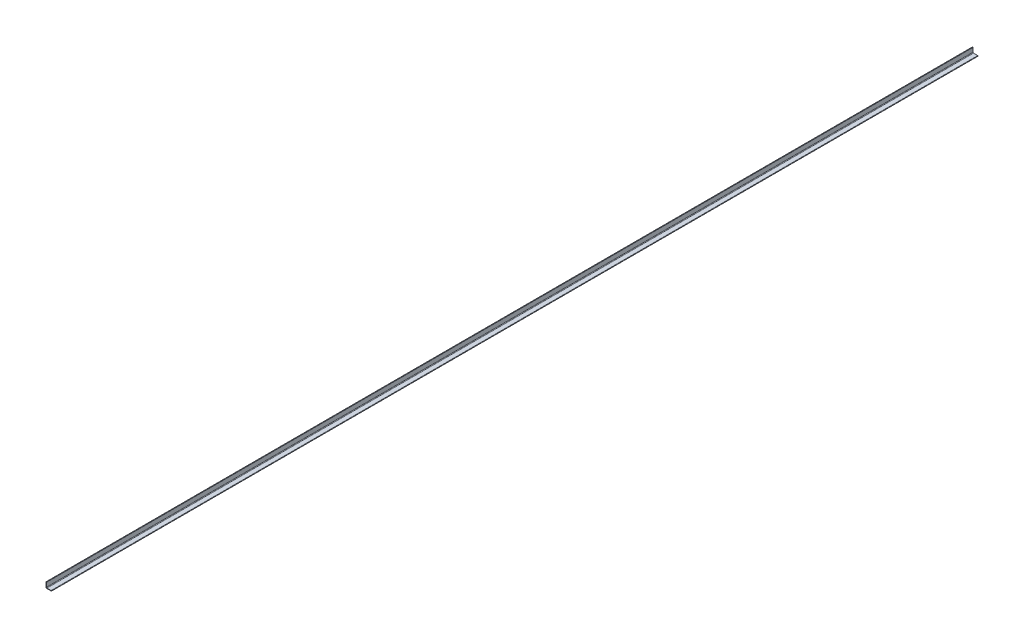
ISO-10303-21;
HEADER;
FILE_DESCRIPTION(('STEP AP214'),'2;1');
FILE_NAME('part.step','',(''),(''),'','','');
FILE_SCHEMA(('AUTOMOTIVE_DESIGN { 1 0 10303 214 1 1 1 1 }'));
ENDSEC;
DATA;
#1=APPLICATION_CONTEXT('core data for automotive mechanical design processes');
#2=APPLICATION_PROTOCOL_DEFINITION('international standard','automotive_design',2000,#1);
#3=PRODUCT_CONTEXT('',#1,'mechanical');
#4=PRODUCT('Part','Part','',(#3));
#5=PRODUCT_RELATED_PRODUCT_CATEGORY('part','',(#4));
#6=PRODUCT_DEFINITION_FORMATION('','',#4);
#7=PRODUCT_DEFINITION_CONTEXT('part definition',#1,'design');
#8=PRODUCT_DEFINITION('design','',#6,#7);
#9=PRODUCT_DEFINITION_SHAPE('','',#8);
#10=(LENGTH_UNIT() NAMED_UNIT(*) SI_UNIT(.MILLI.,.METRE.));
#11=(NAMED_UNIT(*) PLANE_ANGLE_UNIT() SI_UNIT($,.RADIAN.));
#12=(NAMED_UNIT(*) SI_UNIT($,.STERADIAN.) SOLID_ANGLE_UNIT());
#13=UNCERTAINTY_MEASURE_WITH_UNIT(LENGTH_MEASURE(1.E-05),#10,'distance_accuracy_value','');
#14=(GEOMETRIC_REPRESENTATION_CONTEXT(3) GLOBAL_UNCERTAINTY_ASSIGNED_CONTEXT((#13)) GLOBAL_UNIT_ASSIGNED_CONTEXT((#10,
#11,#12)) REPRESENTATION_CONTEXT('',''));
#15=CARTESIAN_POINT('',(0.,0.,0.));
#16=DIRECTION('',(0.,0.,1.));
#17=DIRECTION('',(1.,0.,0.));
#18=AXIS2_PLACEMENT_3D('',#15,#16,#17);
#19=CARTESIAN_POINT('',(14.224,6.35,0.));
#20=DIRECTION('',(0.,1.,0.));
#21=DIRECTION('',(0.,0.,1.));
#22=AXIS2_PLACEMENT_3D('',#19,#20,#21);
#23=PLANE('',#22);
#24=DIRECTION('',(1.,0.,0.));
#25=VECTOR('',#24,1.);
#26=CARTESIAN_POINT('',(14.224,6.35,13016.611));
#27=LINE('',#26,#25);
#28=CARTESIAN_POINT('',(14.224,6.35,13016.611));
#29=VERTEX_POINT('',#28);
#30=CARTESIAN_POINT('',(72.39,6.35000000000003,13016.611));
#31=VERTEX_POINT('',#30);
#32=EDGE_CURVE('E10',#29,#31,#27,.T.);
#33=ORIENTED_EDGE('',*,*,#32,.T.);
#34=DIRECTION('',(0.,0.,1.));
#35=VECTOR('',#34,1.);
#36=CARTESIAN_POINT('',(72.39,6.35000000000003,0.));
#37=LINE('',#36,#35);
#38=CARTESIAN_POINT('',(72.39,6.35000000000003,0.));
#39=VERTEX_POINT('',#38);
#40=EDGE_CURVE('E35',#39,#31,#37,.T.);
#41=ORIENTED_EDGE('',*,*,#40,.F.);
#42=DIRECTION('',(1.,0.,0.));
#43=VECTOR('',#42,1.);
#44=CARTESIAN_POINT('',(14.224,6.35,0.));
#45=LINE('',#44,#43);
#46=CARTESIAN_POINT('',(14.224,6.35,0.));
#47=VERTEX_POINT('',#46);
#48=EDGE_CURVE('E107',#47,#39,#45,.T.);
#49=ORIENTED_EDGE('',*,*,#48,.F.);
#50=DIRECTION('',(0.,0.,1.));
#51=VECTOR('',#50,1.);
#52=CARTESIAN_POINT('',(14.224,6.35,0.));
#53=LINE('',#52,#51);
#54=EDGE_CURVE('E26',#47,#29,#53,.T.);
#55=ORIENTED_EDGE('',*,*,#54,.T.);
#56=EDGE_LOOP('',(#33,#41,#49,#55));
#57=FACE_BOUND('',#56,.T.);
#58=ADVANCED_FACE('F16',(#57),#23,.T.);
#59=CARTESIAN_POINT('',(72.39,2.54000000000003,0.));
#60=DIRECTION('',(0.,0.,1.));
#61=DIRECTION('',(1.,0.,0.));
#62=AXIS2_PLACEMENT_3D('',#59,#60,#61);
#63=CYLINDRICAL_SURFACE('',#62,3.81);
#64=CARTESIAN_POINT('',(72.39,2.54000000000003,13016.611));
#65=DIRECTION('',(0.,0.,-1.));
#66=DIRECTION('',(0.,-1.,0.));
#67=AXIS2_PLACEMENT_3D('',#64,#65,#66);
#68=CIRCLE('',#67,3.81);
#69=CARTESIAN_POINT('',(76.2,2.54000000000003,13016.611));
#70=VERTEX_POINT('',#69);
#71=EDGE_CURVE('E115',#31,#70,#68,.T.);
#72=ORIENTED_EDGE('',*,*,#71,.T.);
#73=DIRECTION('',(0.,0.,1.));
#74=VECTOR('',#73,1.);
#75=CARTESIAN_POINT('',(76.2,2.54000000000003,0.));
#76=LINE('',#75,#74);
#77=CARTESIAN_POINT('',(76.2,2.54000000000003,0.));
#78=VERTEX_POINT('',#77);
#79=EDGE_CURVE('E117',#78,#70,#76,.T.);
#80=ORIENTED_EDGE('',*,*,#79,.F.);
#81=CARTESIAN_POINT('',(72.39,2.54000000000003,0.));
#82=DIRECTION('',(0.,0.,-1.));
#83=DIRECTION('',(0.,-1.,0.));
#84=AXIS2_PLACEMENT_3D('',#81,#82,#83);
#85=CIRCLE('',#84,3.81);
#86=EDGE_CURVE('E108',#39,#78,#85,.T.);
#87=ORIENTED_EDGE('',*,*,#86,.F.);
#88=ORIENTED_EDGE('',*,*,#40,.T.);
#89=EDGE_LOOP('',(#72,#80,#87,#88));
#90=FACE_BOUND('',#89,.T.);
#91=ADVANCED_FACE('F160',(#90),#63,.T.);
#92=CARTESIAN_POINT('',(76.2,2.54000000000003,0.));
#93=DIRECTION('',(1.,0.,0.));
#94=DIRECTION('',(0.,0.,-1.));
#95=AXIS2_PLACEMENT_3D('',#92,#93,#94);
#96=PLANE('',#95);
#97=DIRECTION('',(0.,-1.,0.));
#98=VECTOR('',#97,1.);
#99=CARTESIAN_POINT('',(76.2,2.54000000000003,13016.611));
#100=LINE('',#99,#98);
#101=CARTESIAN_POINT('',(76.2,0.,13016.611));
#102=VERTEX_POINT('',#101);
#103=EDGE_CURVE('E118',#70,#102,#100,.T.);
#104=ORIENTED_EDGE('',*,*,#103,.T.);
#105=DIRECTION('',(0.,0.,1.));
#106=VECTOR('',#105,1.);
#107=CARTESIAN_POINT('',(76.2,0.,0.));
#108=LINE('',#107,#106);
#109=CARTESIAN_POINT('',(76.2,0.,0.));
#110=VERTEX_POINT('',#109);
#111=EDGE_CURVE('E123',#110,#102,#108,.T.);
#112=ORIENTED_EDGE('',*,*,#111,.F.);
#113=DIRECTION('',(0.,-1.,0.));
#114=VECTOR('',#113,1.);
#115=CARTESIAN_POINT('',(76.2,2.54000000000003,0.));
#116=LINE('',#115,#114);
#117=EDGE_CURVE('E110',#78,#110,#116,.T.);
#118=ORIENTED_EDGE('',*,*,#117,.F.);
#119=ORIENTED_EDGE('',*,*,#79,.T.);
#120=EDGE_LOOP('',(#104,#112,#118,#119));
#121=FACE_BOUND('',#120,.T.);
#122=ADVANCED_FACE('F166',(#121),#96,.T.);
#123=CARTESIAN_POINT('',(76.2,0.,0.));
#124=DIRECTION('',(0.,-1.,0.));
#125=DIRECTION('',(0.,0.,-1.));
#126=AXIS2_PLACEMENT_3D('',#123,#124,#125);
#127=PLANE('',#126);
#128=DIRECTION('',(-1.,0.,0.));
#129=VECTOR('',#128,1.);
#130=CARTESIAN_POINT('',(76.2,0.,13016.611));
#131=LINE('',#130,#129);
#132=CARTESIAN_POINT('',(0.,0.,13016.611));
#133=VERTEX_POINT('',#132);
#134=EDGE_CURVE('E119',#102,#133,#131,.T.);
#135=ORIENTED_EDGE('',*,*,#134,.T.);
#136=DIRECTION('',(0.,0.,1.));
#137=VECTOR('',#136,1.);
#138=CARTESIAN_POINT('',(0.,0.,0.));
#139=LINE('',#138,#137);
#140=CARTESIAN_POINT('',(0.,0.,0.));
#141=VERTEX_POINT('',#140);
#142=EDGE_CURVE('E130',#141,#133,#139,.T.);
#143=ORIENTED_EDGE('',*,*,#142,.F.);
#144=DIRECTION('',(-1.,0.,0.));
#145=VECTOR('',#144,1.);
#146=CARTESIAN_POINT('',(76.2,0.,0.));
#147=LINE('',#146,#145);
#148=EDGE_CURVE('E127',#110,#141,#147,.T.);
#149=ORIENTED_EDGE('',*,*,#148,.F.);
#150=ORIENTED_EDGE('',*,*,#111,.T.);
#151=EDGE_LOOP('',(#135,#143,#149,#150));
#152=FACE_BOUND('',#151,.T.);
#153=ADVANCED_FACE('F169',(#152),#127,.T.);
#154=CARTESIAN_POINT('',(0.,0.,0.));
#155=DIRECTION('',(-1.,0.,0.));
#156=DIRECTION('',(0.,0.,1.));
#157=AXIS2_PLACEMENT_3D('',#154,#155,#156);
#158=PLANE('',#157);
#159=DIRECTION('',(0.,1.,0.));
#160=VECTOR('',#159,1.);
#161=CARTESIAN_POINT('',(0.,0.,13016.611));
#162=LINE('',#161,#160);
#163=CARTESIAN_POINT('',(0.,76.2,13016.611));
#164=VERTEX_POINT('',#163);
#165=EDGE_CURVE('E125',#133,#164,#162,.T.);
#166=ORIENTED_EDGE('',*,*,#165,.T.);
#167=DIRECTION('',(0.,0.,1.));
#168=VECTOR('',#167,1.);
#169=CARTESIAN_POINT('',(0.,76.2,0.));
#170=LINE('',#169,#168);
#171=CARTESIAN_POINT('',(0.,76.2,0.));
#172=VERTEX_POINT('',#171);
#173=EDGE_CURVE('E136',#172,#164,#170,.T.);
#174=ORIENTED_EDGE('',*,*,#173,.F.);
#175=DIRECTION('',(0.,1.,0.));
#176=VECTOR('',#175,1.);
#177=CARTESIAN_POINT('',(0.,0.,0.));
#178=LINE('',#177,#176);
#179=EDGE_CURVE('E103',#141,#172,#178,.T.);
#180=ORIENTED_EDGE('',*,*,#179,.F.);
#181=ORIENTED_EDGE('',*,*,#142,.T.);
#182=EDGE_LOOP('',(#166,#174,#180,#181));
#183=FACE_BOUND('',#182,.T.);
#184=ADVANCED_FACE('F173',(#183),#158,.T.);
#185=CARTESIAN_POINT('',(0.,76.2,0.));
#186=DIRECTION('',(0.,1.,0.));
#187=DIRECTION('',(0.,0.,1.));
#188=AXIS2_PLACEMENT_3D('',#185,#186,#187);
#189=PLANE('',#188);
#190=DIRECTION('',(1.,0.,0.));
#191=VECTOR('',#190,1.);
#192=CARTESIAN_POINT('',(0.,76.2,13016.611));
#193=LINE('',#192,#191);
#194=CARTESIAN_POINT('',(2.53999999999998,76.2,13016.611));
#195=VERTEX_POINT('',#194);
#196=EDGE_CURVE('E132',#164,#195,#193,.T.);
#197=ORIENTED_EDGE('',*,*,#196,.T.);
#198=DIRECTION('',(0.,0.,1.));
#199=VECTOR('',#198,1.);
#200=CARTESIAN_POINT('',(2.53999999999998,76.2,0.));
#201=LINE('',#200,#199);
#202=CARTESIAN_POINT('',(2.53999999999998,76.2,0.));
#203=VERTEX_POINT('',#202);
#204=EDGE_CURVE('E143',#203,#195,#201,.T.);
#205=ORIENTED_EDGE('',*,*,#204,.F.);
#206=DIRECTION('',(1.,0.,0.));
#207=VECTOR('',#206,1.);
#208=CARTESIAN_POINT('',(0.,76.2,0.));
#209=LINE('',#208,#207);
#210=EDGE_CURVE('E140',#172,#203,#209,.T.);
#211=ORIENTED_EDGE('',*,*,#210,.F.);
#212=ORIENTED_EDGE('',*,*,#173,.T.);
#213=EDGE_LOOP('',(#197,#205,#211,#212));
#214=FACE_BOUND('',#213,.T.);
#215=ADVANCED_FACE('F177',(#214),#189,.T.);
#216=CARTESIAN_POINT('',(2.53999999999998,72.39,0.));
#217=DIRECTION('',(0.,0.,1.));
#218=DIRECTION('',(1.,0.,0.));
#219=AXIS2_PLACEMENT_3D('',#216,#217,#218);
#220=CYLINDRICAL_SURFACE('',#219,3.81);
#221=CARTESIAN_POINT('',(2.53999999999998,72.39,13016.611));
#222=DIRECTION('',(0.,0.,-1.));
#223=DIRECTION('',(0.,-1.,0.));
#224=AXIS2_PLACEMENT_3D('',#221,#222,#223);
#225=CIRCLE('',#224,3.81);
#226=CARTESIAN_POINT('',(6.34999999999998,72.39,13016.611));
#227=VERTEX_POINT('',#226);
#228=EDGE_CURVE('E138',#195,#227,#225,.T.);
#229=ORIENTED_EDGE('',*,*,#228,.T.);
#230=DIRECTION('',(0.,0.,1.));
#231=VECTOR('',#230,1.);
#232=CARTESIAN_POINT('',(6.34999999999998,72.39,0.));
#233=LINE('',#232,#231);
#234=CARTESIAN_POINT('',(6.34999999999998,72.39,0.));
#235=VERTEX_POINT('',#234);
#236=EDGE_CURVE('E148',#235,#227,#233,.T.);
#237=ORIENTED_EDGE('',*,*,#236,.F.);
#238=CARTESIAN_POINT('',(2.53999999999998,72.39,0.));
#239=DIRECTION('',(0.,0.,-1.));
#240=DIRECTION('',(0.,-1.,0.));
#241=AXIS2_PLACEMENT_3D('',#238,#239,#240);
#242=CIRCLE('',#241,3.81);
#243=EDGE_CURVE('E94',#203,#235,#242,.T.);
#244=ORIENTED_EDGE('',*,*,#243,.F.);
#245=ORIENTED_EDGE('',*,*,#204,.T.);
#246=EDGE_LOOP('',(#229,#237,#244,#245));
#247=FACE_BOUND('',#246,.T.);
#248=ADVANCED_FACE('F180',(#247),#220,.T.);
#249=CARTESIAN_POINT('',(6.34999999999998,72.39,0.));
#250=DIRECTION('',(1.,0.,0.));
#251=DIRECTION('',(0.,0.,-1.));
#252=AXIS2_PLACEMENT_3D('',#249,#250,#251);
#253=PLANE('',#252);
#254=DIRECTION('',(0.,-1.,0.));
#255=VECTOR('',#254,1.);
#256=CARTESIAN_POINT('',(6.34999999999998,72.39,13016.611));
#257=LINE('',#256,#255);
#258=CARTESIAN_POINT('',(6.35,14.224,13016.611));
#259=VERTEX_POINT('',#258);
#260=EDGE_CURVE('E100',#227,#259,#257,.T.);
#261=ORIENTED_EDGE('',*,*,#260,.T.);
#262=DIRECTION('',(0.,0.,1.));
#263=VECTOR('',#262,1.);
#264=CARTESIAN_POINT('',(6.35,14.224,0.));
#265=LINE('',#264,#263);
#266=CARTESIAN_POINT('',(6.35,14.224,0.));
#267=VERTEX_POINT('',#266);
#268=EDGE_CURVE('E85',#267,#259,#265,.T.);
#269=ORIENTED_EDGE('',*,*,#268,.F.);
#270=DIRECTION('',(0.,-1.,0.));
#271=VECTOR('',#270,1.);
#272=CARTESIAN_POINT('',(6.34999999999998,72.39,0.));
#273=LINE('',#272,#271);
#274=EDGE_CURVE('E91',#235,#267,#273,.T.);
#275=ORIENTED_EDGE('',*,*,#274,.F.);
#276=ORIENTED_EDGE('',*,*,#236,.T.);
#277=EDGE_LOOP('',(#261,#269,#275,#276));
#278=FACE_BOUND('',#277,.T.);
#279=ADVANCED_FACE('F98',(#278),#253,.T.);
#280=CARTESIAN_POINT('',(14.224,14.224,0.));
#281=DIRECTION('',(0.,0.,1.));
#282=DIRECTION('',(1.,0.,0.));
#283=AXIS2_PLACEMENT_3D('',#280,#281,#282);
#284=CYLINDRICAL_SURFACE('',#283,7.874);
#285=CARTESIAN_POINT('',(14.224,14.224,13016.611));
#286=DIRECTION('',(0.,0.,1.));
#287=DIRECTION('',(1.,0.,0.));
#288=AXIS2_PLACEMENT_3D('',#285,#286,#287);
#289=CIRCLE('',#288,7.874);
#290=EDGE_CURVE('E102',#259,#29,#289,.T.);
#291=ORIENTED_EDGE('',*,*,#290,.T.);
#292=ORIENTED_EDGE('',*,*,#54,.F.);
#293=CARTESIAN_POINT('',(14.224,14.224,0.));
#294=DIRECTION('',(0.,0.,1.));
#295=DIRECTION('',(1.,0.,0.));
#296=AXIS2_PLACEMENT_3D('',#293,#294,#295);
#297=CIRCLE('',#296,7.874);
#298=EDGE_CURVE('E20',#267,#47,#297,.T.);
#299=ORIENTED_EDGE('',*,*,#298,.F.);
#300=ORIENTED_EDGE('',*,*,#268,.T.);
#301=EDGE_LOOP('',(#291,#292,#299,#300));
#302=FACE_BOUND('',#301,.T.);
#303=ADVANCED_FACE('F18',(#302),#284,.F.);
#304=CARTESIAN_POINT('',(38.1,38.1,0.));
#305=DIRECTION('',(0.,0.,1.));
#306=DIRECTION('',(1.,0.,0.));
#307=AXIS2_PLACEMENT_3D('',#304,#305,#306);
#308=PLANE('',#307);
#309=ORIENTED_EDGE('',*,*,#179,.T.);
#310=ORIENTED_EDGE('',*,*,#210,.T.);
#311=ORIENTED_EDGE('',*,*,#243,.T.);
#312=ORIENTED_EDGE('',*,*,#274,.T.);
#313=ORIENTED_EDGE('',*,*,#298,.T.);
#314=ORIENTED_EDGE('',*,*,#48,.T.);
#315=ORIENTED_EDGE('',*,*,#86,.T.);
#316=ORIENTED_EDGE('',*,*,#117,.T.);
#317=ORIENTED_EDGE('',*,*,#148,.T.);
#318=EDGE_LOOP('',(#309,#310,#311,#312,#313,#314,#315,#316,#317));
#319=FACE_BOUND('',#318,.T.);
#320=ADVANCED_FACE('F92',(#319),#308,.F.);
#321=CARTESIAN_POINT('',(38.1,38.1,13016.611));
#322=DIRECTION('',(0.,0.,1.));
#323=DIRECTION('',(1.,0.,0.));
#324=AXIS2_PLACEMENT_3D('',#321,#322,#323);
#325=PLANE('',#324);
#326=ORIENTED_EDGE('',*,*,#165,.F.);
#327=ORIENTED_EDGE('',*,*,#134,.F.);
#328=ORIENTED_EDGE('',*,*,#103,.F.);
#329=ORIENTED_EDGE('',*,*,#71,.F.);
#330=ORIENTED_EDGE('',*,*,#32,.F.);
#331=ORIENTED_EDGE('',*,*,#290,.F.);
#332=ORIENTED_EDGE('',*,*,#260,.F.);
#333=ORIENTED_EDGE('',*,*,#228,.F.);
#334=ORIENTED_EDGE('',*,*,#196,.F.);
#335=EDGE_LOOP('',(#326,#327,#328,#329,#330,#331,#332,#333,#334));
#336=FACE_BOUND('',#335,.T.);
#337=ADVANCED_FACE('F154',(#336),#325,.T.);
#338=CLOSED_SHELL('',(#58,#91,#122,#153,#184,#215,#248,#279,#303,#320,#337));
#339=MANIFOLD_SOLID_BREP('B1',#338);
#340=ADVANCED_BREP_SHAPE_REPRESENTATION('',(#18,#339),#14);
#341=SHAPE_DEFINITION_REPRESENTATION(#9,#340);
ENDSEC;
END-ISO-10303-21;
